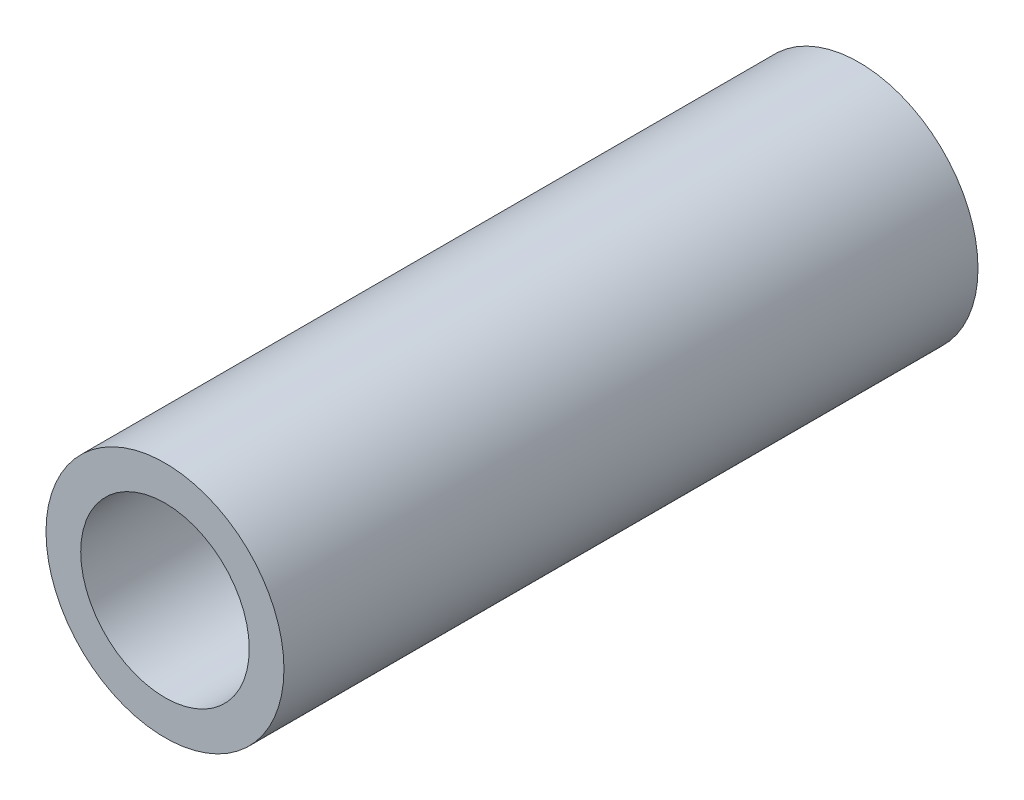
ISO-10303-21;
HEADER;
FILE_DESCRIPTION(('STEP AP214'),'2;1');
FILE_NAME('part.step','',(''),(''),'','','');
FILE_SCHEMA(('AUTOMOTIVE_DESIGN { 1 0 10303 214 1 1 1 1 }'));
ENDSEC;
DATA;
#1=APPLICATION_CONTEXT('core data for automotive mechanical design processes');
#2=APPLICATION_PROTOCOL_DEFINITION('international standard','automotive_design',2000,#1);
#3=PRODUCT_CONTEXT('',#1,'mechanical');
#4=PRODUCT('Part','Part','',(#3));
#5=PRODUCT_RELATED_PRODUCT_CATEGORY('part','',(#4));
#6=PRODUCT_DEFINITION_FORMATION('','',#4);
#7=PRODUCT_DEFINITION_CONTEXT('part definition',#1,'design');
#8=PRODUCT_DEFINITION('design','',#6,#7);
#9=PRODUCT_DEFINITION_SHAPE('','',#8);
#10=(LENGTH_UNIT() NAMED_UNIT(*) SI_UNIT(.MILLI.,.METRE.));
#11=(NAMED_UNIT(*) PLANE_ANGLE_UNIT() SI_UNIT($,.RADIAN.));
#12=(NAMED_UNIT(*) SI_UNIT($,.STERADIAN.) SOLID_ANGLE_UNIT());
#13=UNCERTAINTY_MEASURE_WITH_UNIT(LENGTH_MEASURE(1.E-05),#10,'distance_accuracy_value','');
#14=(GEOMETRIC_REPRESENTATION_CONTEXT(3) GLOBAL_UNCERTAINTY_ASSIGNED_CONTEXT((#13)) GLOBAL_UNIT_ASSIGNED_CONTEXT((#10,
#11,#12)) REPRESENTATION_CONTEXT('',''));
#15=CARTESIAN_POINT('',(0.,0.,0.));
#16=DIRECTION('',(0.,0.,1.));
#17=DIRECTION('',(1.,0.,0.));
#18=AXIS2_PLACEMENT_3D('',#15,#16,#17);
#19=CARTESIAN_POINT('',(0.,6.,17.5));
#20=DIRECTION('',(0.,0.,-1.));
#21=DIRECTION('',(-1.,0.,0.));
#22=AXIS2_PLACEMENT_3D('',#19,#20,#21);
#23=PLANE('',#22);
#24=CARTESIAN_POINT('',(0.,0.,17.5));
#25=DIRECTION('',(0.,0.,1.));
#26=DIRECTION('',(1.,0.,0.));
#27=AXIS2_PLACEMENT_3D('',#24,#25,#26);
#28=CIRCLE('',#27,4.25);
#29=CARTESIAN_POINT('',(4.25,0.,17.5));
#30=VERTEX_POINT('',#29);
#31=EDGE_CURVE('E10',#30,#30,#28,.T.);
#32=ORIENTED_EDGE('',*,*,#31,.F.);
#33=EDGE_LOOP('',(#32));
#34=FACE_BOUND('',#33,.T.);
#35=CARTESIAN_POINT('',(0.,0.,17.5));
#36=DIRECTION('',(0.,0.,1.));
#37=DIRECTION('',(1.,0.,0.));
#38=AXIS2_PLACEMENT_3D('',#35,#36,#37);
#39=CIRCLE('',#38,6.);
#40=CARTESIAN_POINT('',(6.,0.,17.5));
#41=VERTEX_POINT('',#40);
#42=EDGE_CURVE('E46',#41,#41,#39,.T.);
#43=ORIENTED_EDGE('',*,*,#42,.T.);
#44=EDGE_LOOP('',(#43));
#45=FACE_BOUND('',#44,.T.);
#46=ADVANCED_FACE('F32',(#34,#45),#23,.F.);
#47=CARTESIAN_POINT('',(0.,0.,75.6783271667227));
#48=DIRECTION('',(0.,0.,1.));
#49=DIRECTION('',(1.,0.,0.));
#50=AXIS2_PLACEMENT_3D('',#47,#48,#49);
#51=CYLINDRICAL_SURFACE('',#50,4.25);
#52=CARTESIAN_POINT('',(0.,0.,-17.5));
#53=DIRECTION('',(0.,0.,1.));
#54=DIRECTION('',(1.,0.,0.));
#55=AXIS2_PLACEMENT_3D('',#52,#53,#54);
#56=CIRCLE('',#55,4.25);
#57=CARTESIAN_POINT('',(4.25,0.,-17.5));
#58=VERTEX_POINT('',#57);
#59=EDGE_CURVE('E38',#58,#58,#56,.T.);
#60=ORIENTED_EDGE('',*,*,#59,.F.);
#61=EDGE_LOOP('',(#60));
#62=FACE_BOUND('',#61,.T.);
#63=ORIENTED_EDGE('',*,*,#31,.T.);
#64=EDGE_LOOP('',(#63));
#65=FACE_BOUND('',#64,.T.);
#66=ADVANCED_FACE('F61',(#62,#65),#51,.F.);
#67=CARTESIAN_POINT('',(0.,6.,-17.5));
#68=DIRECTION('',(0.,0.,1.));
#69=DIRECTION('',(1.,0.,0.));
#70=AXIS2_PLACEMENT_3D('',#67,#68,#69);
#71=PLANE('',#70);
#72=CARTESIAN_POINT('',(0.,0.,-17.5));
#73=DIRECTION('',(0.,0.,1.));
#74=DIRECTION('',(1.,0.,0.));
#75=AXIS2_PLACEMENT_3D('',#72,#73,#74);
#76=CIRCLE('',#75,6.);
#77=CARTESIAN_POINT('',(6.,0.,-17.5));
#78=VERTEX_POINT('',#77);
#79=EDGE_CURVE('E42',#78,#78,#76,.T.);
#80=ORIENTED_EDGE('',*,*,#79,.F.);
#81=EDGE_LOOP('',(#80));
#82=FACE_BOUND('',#81,.T.);
#83=ORIENTED_EDGE('',*,*,#59,.T.);
#84=EDGE_LOOP('',(#83));
#85=FACE_BOUND('',#84,.T.);
#86=ADVANCED_FACE('F56',(#82,#85),#71,.F.);
#87=CARTESIAN_POINT('',(0.,0.,75.6783271667227));
#88=DIRECTION('',(0.,0.,1.));
#89=DIRECTION('',(1.,0.,0.));
#90=AXIS2_PLACEMENT_3D('',#87,#88,#89);
#91=CYLINDRICAL_SURFACE('',#90,6.);
#92=ORIENTED_EDGE('',*,*,#42,.F.);
#93=EDGE_LOOP('',(#92));
#94=FACE_BOUND('',#93,.T.);
#95=ORIENTED_EDGE('',*,*,#79,.T.);
#96=EDGE_LOOP('',(#95));
#97=FACE_BOUND('',#96,.T.);
#98=ADVANCED_FACE('F53',(#94,#97),#91,.T.);
#99=CLOSED_SHELL('',(#46,#66,#86,#98));
#100=MANIFOLD_SOLID_BREP('B2',#99);
#101=ADVANCED_BREP_SHAPE_REPRESENTATION('',(#18,#100),#14);
#102=SHAPE_DEFINITION_REPRESENTATION(#9,#101);
ENDSEC;
END-ISO-10303-21;
